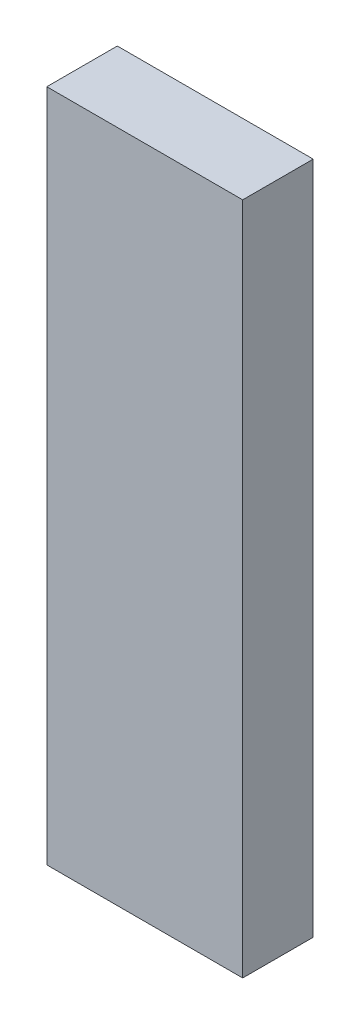
ISO-10303-21;
HEADER;
FILE_DESCRIPTION(('STEP AP214'),'2;1');
FILE_NAME('part.step','',(''),(''),'','','');
FILE_SCHEMA(('AUTOMOTIVE_DESIGN { 1 0 10303 214 1 1 1 1 }'));
ENDSEC;
DATA;
#1=APPLICATION_CONTEXT('core data for automotive mechanical design processes');
#2=APPLICATION_PROTOCOL_DEFINITION('international standard','automotive_design',2000,#1);
#3=PRODUCT_CONTEXT('',#1,'mechanical');
#4=PRODUCT('Part','Part','',(#3));
#5=PRODUCT_RELATED_PRODUCT_CATEGORY('part','',(#4));
#6=PRODUCT_DEFINITION_FORMATION('','',#4);
#7=PRODUCT_DEFINITION_CONTEXT('part definition',#1,'design');
#8=PRODUCT_DEFINITION('design','',#6,#7);
#9=PRODUCT_DEFINITION_SHAPE('','',#8);
#10=(LENGTH_UNIT() NAMED_UNIT(*) SI_UNIT(.MILLI.,.METRE.));
#11=(NAMED_UNIT(*) PLANE_ANGLE_UNIT() SI_UNIT($,.RADIAN.));
#12=(NAMED_UNIT(*) SI_UNIT($,.STERADIAN.) SOLID_ANGLE_UNIT());
#13=UNCERTAINTY_MEASURE_WITH_UNIT(LENGTH_MEASURE(1.E-05),#10,'distance_accuracy_value','');
#14=(GEOMETRIC_REPRESENTATION_CONTEXT(3) GLOBAL_UNCERTAINTY_ASSIGNED_CONTEXT((#13)) GLOBAL_UNIT_ASSIGNED_CONTEXT((#10,
#11,#12)) REPRESENTATION_CONTEXT('',''));
#15=CARTESIAN_POINT('',(0.,0.,0.));
#16=DIRECTION('',(0.,0.,1.));
#17=DIRECTION('',(1.,0.,0.));
#18=AXIS2_PLACEMENT_3D('',#15,#16,#17);
#19=CARTESIAN_POINT('',(25.,86.,18.));
#20=DIRECTION('',(-1.,0.,0.));
#21=DIRECTION('',(0.,-1.,0.));
#22=AXIS2_PLACEMENT_3D('',#19,#20,#21);
#23=PLANE('',#22);
#24=DIRECTION('',(0.,1.,0.));
#25=VECTOR('',#24,1.);
#26=CARTESIAN_POINT('',(25.,86.,0.));
#27=LINE('',#26,#25);
#28=CARTESIAN_POINT('',(25.,-86.,0.));
#29=VERTEX_POINT('',#28);
#30=CARTESIAN_POINT('',(25.,86.,0.));
#31=VERTEX_POINT('',#30);
#32=EDGE_CURVE('E96',#29,#31,#27,.T.);
#33=ORIENTED_EDGE('',*,*,#32,.T.);
#34=DIRECTION('',(0.,0.,-1.));
#35=VECTOR('',#34,1.);
#36=CARTESIAN_POINT('',(25.,86.,18.));
#37=LINE('',#36,#35);
#38=CARTESIAN_POINT('',(25.,86.,18.));
#39=VERTEX_POINT('',#38);
#40=EDGE_CURVE('E11',#39,#31,#37,.T.);
#41=ORIENTED_EDGE('',*,*,#40,.F.);
#42=DIRECTION('',(0.,1.,0.));
#43=VECTOR('',#42,1.);
#44=CARTESIAN_POINT('',(25.,86.,18.));
#45=LINE('',#44,#43);
#46=CARTESIAN_POINT('',(25.,-86.,18.));
#47=VERTEX_POINT('',#46);
#48=EDGE_CURVE('E84',#47,#39,#45,.T.);
#49=ORIENTED_EDGE('',*,*,#48,.F.);
#50=DIRECTION('',(0.,0.,-1.));
#51=VECTOR('',#50,1.);
#52=CARTESIAN_POINT('',(25.,-86.,18.));
#53=LINE('',#52,#51);
#54=EDGE_CURVE('E92',#47,#29,#53,.T.);
#55=ORIENTED_EDGE('',*,*,#54,.T.);
#56=EDGE_LOOP('',(#33,#41,#49,#55));
#57=FACE_BOUND('',#56,.T.);
#58=ADVANCED_FACE('F33',(#57),#23,.F.);
#59=CARTESIAN_POINT('',(-25.,86.,18.));
#60=DIRECTION('',(0.,-1.,0.));
#61=DIRECTION('',(0.,0.,-1.));
#62=AXIS2_PLACEMENT_3D('',#59,#60,#61);
#63=PLANE('',#62);
#64=DIRECTION('',(-1.,0.,0.));
#65=VECTOR('',#64,1.);
#66=CARTESIAN_POINT('',(-25.,86.,0.));
#67=LINE('',#66,#65);
#68=CARTESIAN_POINT('',(-25.,86.,0.));
#69=VERTEX_POINT('',#68);
#70=EDGE_CURVE('E88',#31,#69,#67,.T.);
#71=ORIENTED_EDGE('',*,*,#70,.T.);
#72=DIRECTION('',(0.,0.,-1.));
#73=VECTOR('',#72,1.);
#74=CARTESIAN_POINT('',(-25.,86.,18.));
#75=LINE('',#74,#73);
#76=CARTESIAN_POINT('',(-25.,86.,18.));
#77=VERTEX_POINT('',#76);
#78=EDGE_CURVE('E41',#77,#69,#75,.T.);
#79=ORIENTED_EDGE('',*,*,#78,.F.);
#80=DIRECTION('',(-1.,0.,0.));
#81=VECTOR('',#80,1.);
#82=CARTESIAN_POINT('',(-25.,86.,18.));
#83=LINE('',#82,#81);
#84=EDGE_CURVE('E79',#39,#77,#83,.T.);
#85=ORIENTED_EDGE('',*,*,#84,.F.);
#86=ORIENTED_EDGE('',*,*,#40,.T.);
#87=EDGE_LOOP('',(#71,#79,#85,#86));
#88=FACE_BOUND('',#87,.T.);
#89=ADVANCED_FACE('F87',(#88),#63,.F.);
#90=CARTESIAN_POINT('',(-25.,86.,18.));
#91=DIRECTION('',(1.,0.,0.));
#92=DIRECTION('',(0.,1.,0.));
#93=AXIS2_PLACEMENT_3D('',#90,#91,#92);
#94=PLANE('',#93);
#95=DIRECTION('',(0.,-1.,0.));
#96=VECTOR('',#95,1.);
#97=CARTESIAN_POINT('',(-25.,86.,0.));
#98=LINE('',#97,#96);
#99=CARTESIAN_POINT('',(-25.,-86.,0.));
#100=VERTEX_POINT('',#99);
#101=EDGE_CURVE('E66',#69,#100,#98,.T.);
#102=ORIENTED_EDGE('',*,*,#101,.T.);
#103=DIRECTION('',(0.,0.,-1.));
#104=VECTOR('',#103,1.);
#105=CARTESIAN_POINT('',(-25.,-86.,18.));
#106=LINE('',#105,#104);
#107=CARTESIAN_POINT('',(-25.,-86.,18.));
#108=VERTEX_POINT('',#107);
#109=EDGE_CURVE('E89',#108,#100,#106,.T.);
#110=ORIENTED_EDGE('',*,*,#109,.F.);
#111=DIRECTION('',(0.,-1.,0.));
#112=VECTOR('',#111,1.);
#113=CARTESIAN_POINT('',(-25.,86.,18.));
#114=LINE('',#113,#112);
#115=EDGE_CURVE('E82',#77,#108,#114,.T.);
#116=ORIENTED_EDGE('',*,*,#115,.F.);
#117=ORIENTED_EDGE('',*,*,#78,.T.);
#118=EDGE_LOOP('',(#102,#110,#116,#117));
#119=FACE_BOUND('',#118,.T.);
#120=ADVANCED_FACE('F90',(#119),#94,.F.);
#121=CARTESIAN_POINT('',(-25.,-86.,18.));
#122=DIRECTION('',(0.,1.,0.));
#123=DIRECTION('',(0.,0.,1.));
#124=AXIS2_PLACEMENT_3D('',#121,#122,#123);
#125=PLANE('',#124);
#126=DIRECTION('',(1.,0.,0.));
#127=VECTOR('',#126,1.);
#128=CARTESIAN_POINT('',(-25.,-86.,0.));
#129=LINE('',#128,#127);
#130=EDGE_CURVE('E72',#100,#29,#129,.T.);
#131=ORIENTED_EDGE('',*,*,#130,.T.);
#132=ORIENTED_EDGE('',*,*,#54,.F.);
#133=DIRECTION('',(1.,0.,0.));
#134=VECTOR('',#133,1.);
#135=CARTESIAN_POINT('',(-25.,-86.,18.));
#136=LINE('',#135,#134);
#137=EDGE_CURVE('E49',#108,#47,#136,.T.);
#138=ORIENTED_EDGE('',*,*,#137,.F.);
#139=ORIENTED_EDGE('',*,*,#109,.T.);
#140=EDGE_LOOP('',(#131,#132,#138,#139));
#141=FACE_BOUND('',#140,.T.);
#142=ADVANCED_FACE('F103',(#141),#125,.F.);
#143=CARTESIAN_POINT('',(0.,0.,18.));
#144=DIRECTION('',(0.,0.,1.));
#145=DIRECTION('',(1.,0.,0.));
#146=AXIS2_PLACEMENT_3D('',#143,#144,#145);
#147=PLANE('',#146);
#148=ORIENTED_EDGE('',*,*,#48,.T.);
#149=ORIENTED_EDGE('',*,*,#84,.T.);
#150=ORIENTED_EDGE('',*,*,#115,.T.);
#151=ORIENTED_EDGE('',*,*,#137,.T.);
#152=EDGE_LOOP('',(#148,#149,#150,#151));
#153=FACE_BOUND('',#152,.T.);
#154=ADVANCED_FACE('F80',(#153),#147,.T.);
#155=CARTESIAN_POINT('',(0.,0.,0.));
#156=DIRECTION('',(0.,0.,1.));
#157=DIRECTION('',(1.,0.,0.));
#158=AXIS2_PLACEMENT_3D('',#155,#156,#157);
#159=PLANE('',#158);
#160=ORIENTED_EDGE('',*,*,#32,.F.);
#161=ORIENTED_EDGE('',*,*,#130,.F.);
#162=ORIENTED_EDGE('',*,*,#101,.F.);
#163=ORIENTED_EDGE('',*,*,#70,.F.);
#164=EDGE_LOOP('',(#160,#161,#162,#163));
#165=FACE_BOUND('',#164,.T.);
#166=ADVANCED_FACE('F106',(#165),#159,.F.);
#167=CLOSED_SHELL('',(#58,#89,#120,#142,#154,#166));
#168=MANIFOLD_SOLID_BREP('B2',#167);
#169=ADVANCED_BREP_SHAPE_REPRESENTATION('',(#18,#168),#14);
#170=SHAPE_DEFINITION_REPRESENTATION(#9,#169);
ENDSEC;
END-ISO-10303-21;
